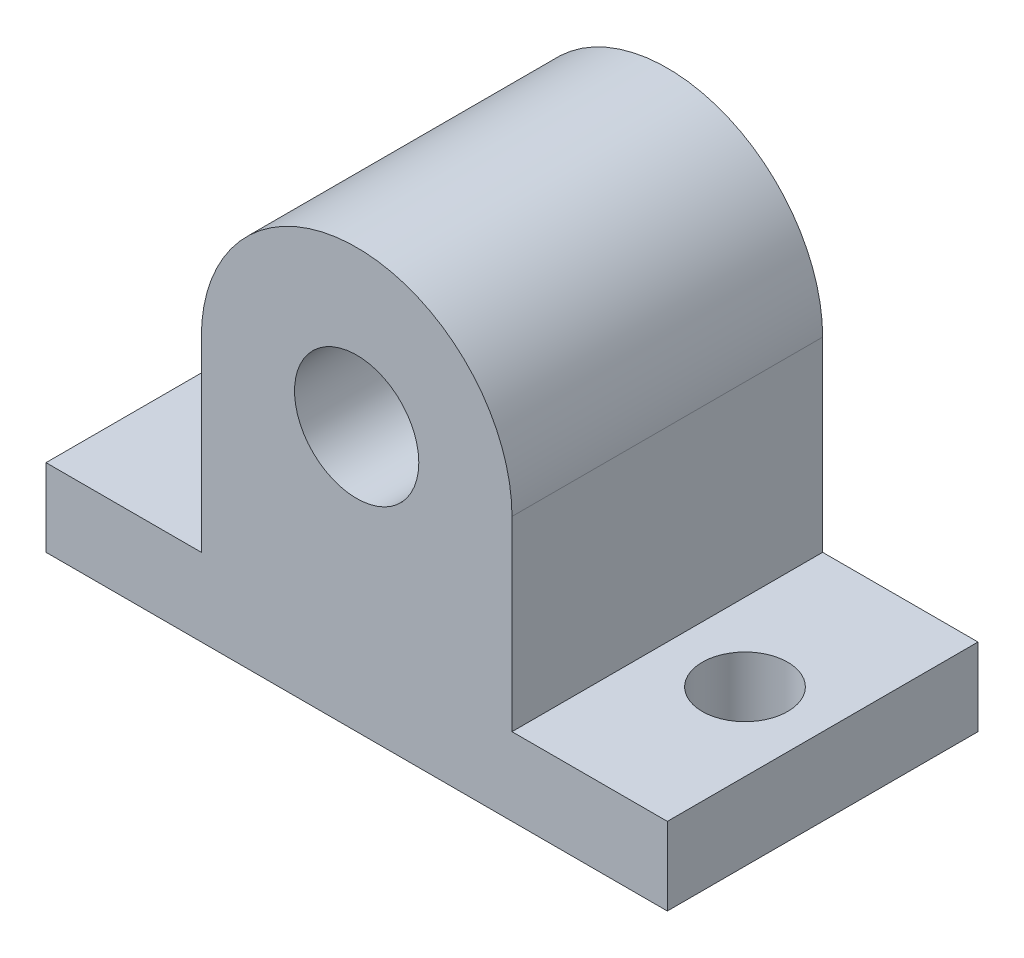
ISO-10303-21;
HEADER;
FILE_DESCRIPTION(('STEP AP214'),'2;1');
FILE_NAME('part.step','',(''),(''),'','','');
FILE_SCHEMA(('AUTOMOTIVE_DESIGN { 1 0 10303 214 1 1 1 1 }'));
ENDSEC;
DATA;
#1=APPLICATION_CONTEXT('core data for automotive mechanical design processes');
#2=APPLICATION_PROTOCOL_DEFINITION('international standard','automotive_design',2000,#1);
#3=PRODUCT_CONTEXT('',#1,'mechanical');
#4=PRODUCT('Part','Part','',(#3));
#5=PRODUCT_RELATED_PRODUCT_CATEGORY('part','',(#4));
#6=PRODUCT_DEFINITION_FORMATION('','',#4);
#7=PRODUCT_DEFINITION_CONTEXT('part definition',#1,'design');
#8=PRODUCT_DEFINITION('design','',#6,#7);
#9=PRODUCT_DEFINITION_SHAPE('','',#8);
#10=(LENGTH_UNIT() NAMED_UNIT(*) SI_UNIT(.MILLI.,.METRE.));
#11=(NAMED_UNIT(*) PLANE_ANGLE_UNIT() SI_UNIT($,.RADIAN.));
#12=(NAMED_UNIT(*) SI_UNIT($,.STERADIAN.) SOLID_ANGLE_UNIT());
#13=UNCERTAINTY_MEASURE_WITH_UNIT(LENGTH_MEASURE(1.E-05),#10,'distance_accuracy_value','');
#14=(GEOMETRIC_REPRESENTATION_CONTEXT(3) GLOBAL_UNCERTAINTY_ASSIGNED_CONTEXT((#13)) GLOBAL_UNIT_ASSIGNED_CONTEXT((#10,
#11,#12)) REPRESENTATION_CONTEXT('',''));
#15=CARTESIAN_POINT('',(0.,0.,0.));
#16=DIRECTION('',(0.,0.,1.));
#17=DIRECTION('',(1.,0.,0.));
#18=AXIS2_PLACEMENT_3D('',#15,#16,#17);
#19=CARTESIAN_POINT('',(0.,5.,0.));
#20=DIRECTION('',(0.,1.,0.));
#21=DIRECTION('',(0.,0.,1.));
#22=AXIS2_PLACEMENT_3D('',#19,#20,#21);
#23=PLANE('',#22);
#24=CARTESIAN_POINT('',(18.5220125786164,5.,5.15723270440251));
#25=DIRECTION('',(0.,1.,0.));
#26=DIRECTION('',(0.,0.,1.));
#27=AXIS2_PLACEMENT_3D('',#24,#25,#26);
#28=CIRCLE('',#27,2.75);
#29=CARTESIAN_POINT('',(18.5220125786164,5.,7.90723270440251));
#30=VERTEX_POINT('',#29);
#31=EDGE_CURVE('E198',#30,#30,#28,.T.);
#32=ORIENTED_EDGE('',*,*,#31,.F.);
#33=EDGE_LOOP('',(#32));
#34=FACE_BOUND('',#33,.T.);
#35=DIRECTION('',(-1.,0.,0.));
#36=VECTOR('',#35,1.);
#37=CARTESIAN_POINT('',(-16.4779874213836,5.,-4.84276729559749));
#38=LINE('',#37,#36);
#39=CARTESIAN_POINT('',(23.5220125786164,5.,-4.84276729559749));
#40=VERTEX_POINT('',#39);
#41=CARTESIAN_POINT('',(13.5220125786164,5.,-4.84276729559749));
#42=VERTEX_POINT('',#41);
#43=EDGE_CURVE('E70',#40,#42,#38,.T.);
#44=ORIENTED_EDGE('',*,*,#43,.T.);
#45=DIRECTION('',(0.,0.,1.));
#46=VECTOR('',#45,1.);
#47=CARTESIAN_POINT('',(13.5220125786164,5.,-34.5749047902345));
#48=LINE('',#47,#46);
#49=CARTESIAN_POINT('',(13.5220125786164,5.,15.1572327044025));
#50=VERTEX_POINT('',#49);
#51=EDGE_CURVE('E145',#42,#50,#48,.T.);
#52=ORIENTED_EDGE('',*,*,#51,.T.);
#53=DIRECTION('',(1.,0.,0.));
#54=VECTOR('',#53,1.);
#55=CARTESIAN_POINT('',(-16.4779874213836,5.,15.1572327044025));
#56=LINE('',#55,#54);
#57=CARTESIAN_POINT('',(23.5220125786164,5.,15.1572327044025));
#58=VERTEX_POINT('',#57);
#59=EDGE_CURVE('E156',#50,#58,#56,.T.);
#60=ORIENTED_EDGE('',*,*,#59,.T.);
#61=DIRECTION('',(0.,0.,-1.));
#62=VECTOR('',#61,1.);
#63=CARTESIAN_POINT('',(23.5220125786164,5.,-4.84276729559749));
#64=LINE('',#63,#62);
#65=EDGE_CURVE('E160',#58,#40,#64,.T.);
#66=ORIENTED_EDGE('',*,*,#65,.T.);
#67=EDGE_LOOP('',(#44,#52,#60,#66));
#68=FACE_BOUND('',#67,.T.);
#69=ADVANCED_FACE('F47',(#34,#68),#23,.T.);
#70=CARTESIAN_POINT('',(-16.4779874213836,5.,-4.84276729559749));
#71=DIRECTION('',(1.,0.,0.));
#72=DIRECTION('',(0.,0.,-1.));
#73=AXIS2_PLACEMENT_3D('',#70,#71,#72);
#74=PLANE('',#73);
#75=DIRECTION('',(0.,0.,1.));
#76=VECTOR('',#75,1.);
#77=CARTESIAN_POINT('',(-16.4779874213836,0.,-4.84276729559749));
#78=LINE('',#77,#76);
#79=CARTESIAN_POINT('',(-16.4779874213836,0.,-4.84276729559749));
#80=VERTEX_POINT('',#79);
#81=CARTESIAN_POINT('',(-16.4779874213836,0.,15.1572327044025));
#82=VERTEX_POINT('',#81);
#83=EDGE_CURVE('E151',#80,#82,#78,.T.);
#84=ORIENTED_EDGE('',*,*,#83,.T.);
#85=DIRECTION('',(0.,-1.,0.));
#86=VECTOR('',#85,1.);
#87=CARTESIAN_POINT('',(-16.4779874213836,5.,15.1572327044025));
#88=LINE('',#87,#86);
#89=CARTESIAN_POINT('',(-16.4779874213836,5.,15.1572327044025));
#90=VERTEX_POINT('',#89);
#91=EDGE_CURVE('E13',#90,#82,#88,.T.);
#92=ORIENTED_EDGE('',*,*,#91,.F.);
#93=DIRECTION('',(0.,0.,1.));
#94=VECTOR('',#93,1.);
#95=CARTESIAN_POINT('',(-16.4779874213836,5.,-4.84276729559749));
#96=LINE('',#95,#94);
#97=CARTESIAN_POINT('',(-16.4779874213836,5.,-4.84276729559749));
#98=VERTEX_POINT('',#97);
#99=EDGE_CURVE('E153',#98,#90,#96,.T.);
#100=ORIENTED_EDGE('',*,*,#99,.F.);
#101=DIRECTION('',(0.,-1.,0.));
#102=VECTOR('',#101,1.);
#103=CARTESIAN_POINT('',(-16.4779874213836,5.,-4.84276729559749));
#104=LINE('',#103,#102);
#105=EDGE_CURVE('E164',#98,#80,#104,.T.);
#106=ORIENTED_EDGE('',*,*,#105,.T.);
#107=EDGE_LOOP('',(#84,#92,#100,#106));
#108=FACE_BOUND('',#107,.T.);
#109=ADVANCED_FACE('F49',(#108),#74,.F.);
#110=CARTESIAN_POINT('',(-16.4779874213836,5.,15.1572327044025));
#111=DIRECTION('',(0.,0.,-1.));
#112=DIRECTION('',(-1.,0.,0.));
#113=AXIS2_PLACEMENT_3D('',#110,#111,#112);
#114=PLANE('',#113);
#115=DIRECTION('',(1.,0.,0.));
#116=VECTOR('',#115,1.);
#117=CARTESIAN_POINT('',(-16.4779874213836,0.,15.1572327044025));
#118=LINE('',#117,#116);
#119=CARTESIAN_POINT('',(23.5220125786164,0.,15.1572327044025));
#120=VERTEX_POINT('',#119);
#121=EDGE_CURVE('E167',#82,#120,#118,.T.);
#122=ORIENTED_EDGE('',*,*,#121,.T.);
#123=DIRECTION('',(0.,-1.,0.));
#124=VECTOR('',#123,1.);
#125=CARTESIAN_POINT('',(23.5220125786164,5.,15.1572327044025));
#126=LINE('',#125,#124);
#127=EDGE_CURVE('E55',#58,#120,#126,.T.);
#128=ORIENTED_EDGE('',*,*,#127,.F.);
#129=ORIENTED_EDGE('',*,*,#59,.F.);
#130=DIRECTION('',(0.,1.,0.));
#131=VECTOR('',#130,1.);
#132=CARTESIAN_POINT('',(13.5220125786164,17.,15.1572327044025));
#133=LINE('',#132,#131);
#134=CARTESIAN_POINT('',(13.5220125786164,17.,15.1572327044025));
#135=VERTEX_POINT('',#134);
#136=EDGE_CURVE('E123',#50,#135,#133,.T.);
#137=ORIENTED_EDGE('',*,*,#136,.T.);
#138=CARTESIAN_POINT('',(3.52201257861635,17.,15.1572327044025));
#139=DIRECTION('',(0.,0.,1.));
#140=DIRECTION('',(1.,0.,0.));
#141=AXIS2_PLACEMENT_3D('',#138,#139,#140);
#142=CIRCLE('',#141,10.);
#143=CARTESIAN_POINT('',(-6.47798742138365,17.,15.1572327044025));
#144=VERTEX_POINT('',#143);
#145=EDGE_CURVE('E118',#135,#144,#142,.T.);
#146=ORIENTED_EDGE('',*,*,#145,.T.);
#147=DIRECTION('',(0.,-1.,0.));
#148=VECTOR('',#147,1.);
#149=CARTESIAN_POINT('',(-6.47798742138365,17.,15.1572327044025));
#150=LINE('',#149,#148);
#151=CARTESIAN_POINT('',(-6.47798742138365,5.,15.1572327044025));
#152=VERTEX_POINT('',#151);
#153=EDGE_CURVE('E126',#144,#152,#150,.T.);
#154=ORIENTED_EDGE('',*,*,#153,.T.);
#155=EDGE_CURVE('E158',#90,#152,#56,.T.);
#156=ORIENTED_EDGE('',*,*,#155,.F.);
#157=ORIENTED_EDGE('',*,*,#91,.T.);
#158=EDGE_LOOP('',(#122,#128,#129,#137,#146,#154,#156,#157));
#159=FACE_BOUND('',#158,.T.);
#160=CARTESIAN_POINT('',(3.52201257861635,17.,15.1572327044025));
#161=DIRECTION('',(0.,0.,1.));
#162=DIRECTION('',(1.,0.,0.));
#163=AXIS2_PLACEMENT_3D('',#160,#161,#162);
#164=CIRCLE('',#163,4.);
#165=CARTESIAN_POINT('',(7.52201257861635,17.,15.1572327044025));
#166=VERTEX_POINT('',#165);
#167=EDGE_CURVE('E134',#166,#166,#164,.T.);
#168=ORIENTED_EDGE('',*,*,#167,.F.);
#169=EDGE_LOOP('',(#168));
#170=FACE_BOUND('',#169,.T.);
#171=ADVANCED_FACE('F130',(#159,#170),#114,.F.);
#172=CARTESIAN_POINT('',(23.5220125786164,5.,-4.84276729559749));
#173=DIRECTION('',(-1.,0.,0.));
#174=DIRECTION('',(0.,0.,1.));
#175=AXIS2_PLACEMENT_3D('',#172,#173,#174);
#176=PLANE('',#175);
#177=DIRECTION('',(0.,0.,-1.));
#178=VECTOR('',#177,1.);
#179=CARTESIAN_POINT('',(23.5220125786164,0.,-4.84276729559749));
#180=LINE('',#179,#178);
#181=CARTESIAN_POINT('',(23.5220125786164,0.,-4.84276729559749));
#182=VERTEX_POINT('',#181);
#183=EDGE_CURVE('E169',#120,#182,#180,.T.);
#184=ORIENTED_EDGE('',*,*,#183,.T.);
#185=DIRECTION('',(0.,-1.,0.));
#186=VECTOR('',#185,1.);
#187=CARTESIAN_POINT('',(23.5220125786164,5.,-4.84276729559749));
#188=LINE('',#187,#186);
#189=EDGE_CURVE('E174',#40,#182,#188,.T.);
#190=ORIENTED_EDGE('',*,*,#189,.F.);
#191=ORIENTED_EDGE('',*,*,#65,.F.);
#192=ORIENTED_EDGE('',*,*,#127,.T.);
#193=EDGE_LOOP('',(#184,#190,#191,#192));
#194=FACE_BOUND('',#193,.T.);
#195=ADVANCED_FACE('F181',(#194),#176,.F.);
#196=CARTESIAN_POINT('',(-16.4779874213836,5.,-4.84276729559749));
#197=DIRECTION('',(0.,0.,1.));
#198=DIRECTION('',(1.,0.,0.));
#199=AXIS2_PLACEMENT_3D('',#196,#197,#198);
#200=PLANE('',#199);
#201=DIRECTION('',(-1.,0.,0.));
#202=VECTOR('',#201,1.);
#203=CARTESIAN_POINT('',(-16.4779874213836,0.,-4.84276729559749));
#204=LINE('',#203,#202);
#205=EDGE_CURVE('E157',#182,#80,#204,.T.);
#206=ORIENTED_EDGE('',*,*,#205,.T.);
#207=ORIENTED_EDGE('',*,*,#105,.F.);
#208=CARTESIAN_POINT('',(-6.47798742138365,5.,-4.84276729559749));
#209=VERTEX_POINT('',#208);
#210=EDGE_CURVE('E162',#209,#98,#38,.T.);
#211=ORIENTED_EDGE('',*,*,#210,.F.);
#212=DIRECTION('',(0.,1.,0.));
#213=VECTOR('',#212,1.);
#214=CARTESIAN_POINT('',(-6.47798742138365,17.,-4.84276729559749));
#215=LINE('',#214,#213);
#216=CARTESIAN_POINT('',(-6.47798742138365,17.,-4.84276729559749));
#217=VERTEX_POINT('',#216);
#218=EDGE_CURVE('E152',#209,#217,#215,.T.);
#219=ORIENTED_EDGE('',*,*,#218,.T.);
#220=CARTESIAN_POINT('',(3.52201257861635,17.,-4.84276729559749));
#221=DIRECTION('',(0.,0.,1.));
#222=DIRECTION('',(1.,0.,0.));
#223=AXIS2_PLACEMENT_3D('',#220,#221,#222);
#224=CIRCLE('',#223,10.);
#225=CARTESIAN_POINT('',(13.5220125786164,17.,-4.84276729559749));
#226=VERTEX_POINT('',#225);
#227=EDGE_CURVE('E120',#217,#226,#224,.F.);
#228=ORIENTED_EDGE('',*,*,#227,.T.);
#229=DIRECTION('',(0.,-1.,0.));
#230=VECTOR('',#229,1.);
#231=CARTESIAN_POINT('',(13.5220125786164,17.,-4.84276729559749));
#232=LINE('',#231,#230);
#233=EDGE_CURVE('E144',#226,#42,#232,.T.);
#234=ORIENTED_EDGE('',*,*,#233,.T.);
#235=ORIENTED_EDGE('',*,*,#43,.F.);
#236=ORIENTED_EDGE('',*,*,#189,.T.);
#237=EDGE_LOOP('',(#206,#207,#211,#219,#228,#234,#235,#236));
#238=FACE_BOUND('',#237,.T.);
#239=CARTESIAN_POINT('',(3.52201257861635,17.,-4.84276729559749));
#240=DIRECTION('',(0.,0.,1.));
#241=DIRECTION('',(1.,0.,0.));
#242=AXIS2_PLACEMENT_3D('',#239,#240,#241);
#243=CIRCLE('',#242,4.);
#244=CARTESIAN_POINT('',(7.52201257861635,17.,-4.84276729559749));
#245=VERTEX_POINT('',#244);
#246=EDGE_CURVE('E148',#245,#245,#243,.F.);
#247=ORIENTED_EDGE('',*,*,#246,.F.);
#248=EDGE_LOOP('',(#247));
#249=FACE_BOUND('',#248,.T.);
#250=ADVANCED_FACE('F189',(#238,#249),#200,.F.);
#251=CARTESIAN_POINT('',(-11.4779874213836,5.,5.15723270440251));
#252=DIRECTION('',(0.,1.,0.));
#253=DIRECTION('',(0.,0.,1.));
#254=AXIS2_PLACEMENT_3D('',#251,#252,#253);
#255=CIRCLE('',#254,2.75);
#256=CARTESIAN_POINT('',(-11.4779874213836,5.,7.90723270440251));
#257=VERTEX_POINT('',#256);
#258=EDGE_CURVE('E223',#257,#257,#255,.T.);
#259=ORIENTED_EDGE('',*,*,#258,.F.);
#260=EDGE_LOOP('',(#259));
#261=FACE_BOUND('',#260,.T.);
#262=DIRECTION('',(0.,0.,1.));
#263=VECTOR('',#262,1.);
#264=CARTESIAN_POINT('',(-6.47798742138365,5.,-34.5749047902345));
#265=LINE('',#264,#263);
#266=EDGE_CURVE('E62',#209,#152,#265,.T.);
#267=ORIENTED_EDGE('',*,*,#266,.F.);
#268=ORIENTED_EDGE('',*,*,#210,.T.);
#269=ORIENTED_EDGE('',*,*,#99,.T.);
#270=ORIENTED_EDGE('',*,*,#155,.T.);
#271=EDGE_LOOP('',(#267,#268,#269,#270));
#272=FACE_BOUND('',#271,.T.);
#273=ADVANCED_FACE('F194',(#261,#272),#23,.T.);
#274=CARTESIAN_POINT('',(0.,0.,0.));
#275=DIRECTION('',(0.,1.,0.));
#276=DIRECTION('',(0.,0.,1.));
#277=AXIS2_PLACEMENT_3D('',#274,#275,#276);
#278=PLANE('',#277);
#279=CARTESIAN_POINT('',(-11.4779874213836,0.,5.15723270440251));
#280=DIRECTION('',(0.,1.,0.));
#281=DIRECTION('',(0.,0.,1.));
#282=AXIS2_PLACEMENT_3D('',#279,#280,#281);
#283=CIRCLE('',#282,2.75);
#284=CARTESIAN_POINT('',(-11.4779874213836,0.,7.90723270440251));
#285=VERTEX_POINT('',#284);
#286=EDGE_CURVE('E137',#285,#285,#283,.T.);
#287=ORIENTED_EDGE('',*,*,#286,.T.);
#288=EDGE_LOOP('',(#287));
#289=FACE_BOUND('',#288,.T.);
#290=CARTESIAN_POINT('',(18.5220125786164,0.,5.15723270440251));
#291=DIRECTION('',(0.,1.,0.));
#292=DIRECTION('',(0.,0.,1.));
#293=AXIS2_PLACEMENT_3D('',#290,#291,#292);
#294=CIRCLE('',#293,2.75);
#295=CARTESIAN_POINT('',(18.5220125786164,0.,7.90723270440251));
#296=VERTEX_POINT('',#295);
#297=EDGE_CURVE('E225',#296,#296,#294,.T.);
#298=ORIENTED_EDGE('',*,*,#297,.T.);
#299=EDGE_LOOP('',(#298));
#300=FACE_BOUND('',#299,.T.);
#301=ORIENTED_EDGE('',*,*,#83,.F.);
#302=ORIENTED_EDGE('',*,*,#205,.F.);
#303=ORIENTED_EDGE('',*,*,#183,.F.);
#304=ORIENTED_EDGE('',*,*,#121,.F.);
#305=EDGE_LOOP('',(#301,#302,#303,#304));
#306=FACE_BOUND('',#305,.T.);
#307=ADVANCED_FACE('F186',(#289,#300,#306),#278,.F.);
#308=CARTESIAN_POINT('',(-6.47798742138365,17.,-34.5749047902345));
#309=DIRECTION('',(-1.,0.,0.));
#310=DIRECTION('',(0.,0.,1.));
#311=AXIS2_PLACEMENT_3D('',#308,#309,#310);
#312=PLANE('',#311);
#313=ORIENTED_EDGE('',*,*,#218,.F.);
#314=ORIENTED_EDGE('',*,*,#266,.T.);
#315=ORIENTED_EDGE('',*,*,#153,.F.);
#316=DIRECTION('',(0.,0.,1.));
#317=VECTOR('',#316,1.);
#318=CARTESIAN_POINT('',(-6.47798742138365,17.,-34.5749047902345));
#319=LINE('',#318,#317);
#320=EDGE_CURVE('E113',#217,#144,#319,.T.);
#321=ORIENTED_EDGE('',*,*,#320,.F.);
#322=EDGE_LOOP('',(#313,#314,#315,#321));
#323=FACE_BOUND('',#322,.T.);
#324=ADVANCED_FACE('F127',(#323),#312,.T.);
#325=CARTESIAN_POINT('',(13.5220125786164,17.,-34.5749047902345));
#326=DIRECTION('',(1.,0.,0.));
#327=DIRECTION('',(0.,1.,0.));
#328=AXIS2_PLACEMENT_3D('',#325,#326,#327);
#329=PLANE('',#328);
#330=ORIENTED_EDGE('',*,*,#233,.F.);
#331=DIRECTION('',(0.,0.,1.));
#332=VECTOR('',#331,1.);
#333=CARTESIAN_POINT('',(13.5220125786164,17.,-34.5749047902345));
#334=LINE('',#333,#332);
#335=EDGE_CURVE('E142',#226,#135,#334,.T.);
#336=ORIENTED_EDGE('',*,*,#335,.T.);
#337=ORIENTED_EDGE('',*,*,#136,.F.);
#338=ORIENTED_EDGE('',*,*,#51,.F.);
#339=EDGE_LOOP('',(#330,#336,#337,#338));
#340=FACE_BOUND('',#339,.T.);
#341=ADVANCED_FACE('F203',(#340),#329,.T.);
#342=CARTESIAN_POINT('',(3.52201257861635,17.,-34.5749047902345));
#343=DIRECTION('',(0.,0.,1.));
#344=DIRECTION('',(1.,0.,0.));
#345=AXIS2_PLACEMENT_3D('',#342,#343,#344);
#346=CYLINDRICAL_SURFACE('',#345,10.);
#347=ORIENTED_EDGE('',*,*,#227,.F.);
#348=ORIENTED_EDGE('',*,*,#320,.T.);
#349=ORIENTED_EDGE('',*,*,#145,.F.);
#350=ORIENTED_EDGE('',*,*,#335,.F.);
#351=EDGE_LOOP('',(#347,#348,#349,#350));
#352=FACE_BOUND('',#351,.T.);
#353=ADVANCED_FACE('F115',(#352),#346,.T.);
#354=CARTESIAN_POINT('',(3.52201257861635,17.,-34.5749047902345));
#355=DIRECTION('',(0.,0.,1.));
#356=DIRECTION('',(1.,0.,0.));
#357=AXIS2_PLACEMENT_3D('',#354,#355,#356);
#358=CYLINDRICAL_SURFACE('',#357,4.);
#359=ORIENTED_EDGE('',*,*,#246,.T.);
#360=EDGE_LOOP('',(#359));
#361=FACE_BOUND('',#360,.T.);
#362=ORIENTED_EDGE('',*,*,#167,.T.);
#363=EDGE_LOOP('',(#362));
#364=FACE_BOUND('',#363,.T.);
#365=ADVANCED_FACE('F237',(#361,#364),#358,.F.);
#366=CARTESIAN_POINT('',(18.5220125786164,0.,5.15723270440251));
#367=DIRECTION('',(0.,1.,0.));
#368=DIRECTION('',(0.,0.,1.));
#369=AXIS2_PLACEMENT_3D('',#366,#367,#368);
#370=CYLINDRICAL_SURFACE('',#369,2.75);
#371=ORIENTED_EDGE('',*,*,#297,.F.);
#372=EDGE_LOOP('',(#371));
#373=FACE_BOUND('',#372,.T.);
#374=ORIENTED_EDGE('',*,*,#31,.T.);
#375=EDGE_LOOP('',(#374));
#376=FACE_BOUND('',#375,.T.);
#377=ADVANCED_FACE('F234',(#373,#376),#370,.F.);
#378=CARTESIAN_POINT('',(-11.4779874213836,0.,5.15723270440251));
#379=DIRECTION('',(0.,1.,0.));
#380=DIRECTION('',(0.,0.,1.));
#381=AXIS2_PLACEMENT_3D('',#378,#379,#380);
#382=CYLINDRICAL_SURFACE('',#381,2.75);
#383=ORIENTED_EDGE('',*,*,#286,.F.);
#384=EDGE_LOOP('',(#383));
#385=FACE_BOUND('',#384,.T.);
#386=ORIENTED_EDGE('',*,*,#258,.T.);
#387=EDGE_LOOP('',(#386));
#388=FACE_BOUND('',#387,.T.);
#389=ADVANCED_FACE('F236',(#385,#388),#382,.F.);
#390=CLOSED_SHELL('',(#69,#109,#171,#195,#250,#273,#307,#324,#341,#353,#365,#377,#389));
#391=MANIFOLD_SOLID_BREP('B2',#390);
#392=ADVANCED_BREP_SHAPE_REPRESENTATION('',(#18,#391),#14);
#393=SHAPE_DEFINITION_REPRESENTATION(#9,#392);
ENDSEC;
END-ISO-10303-21;
